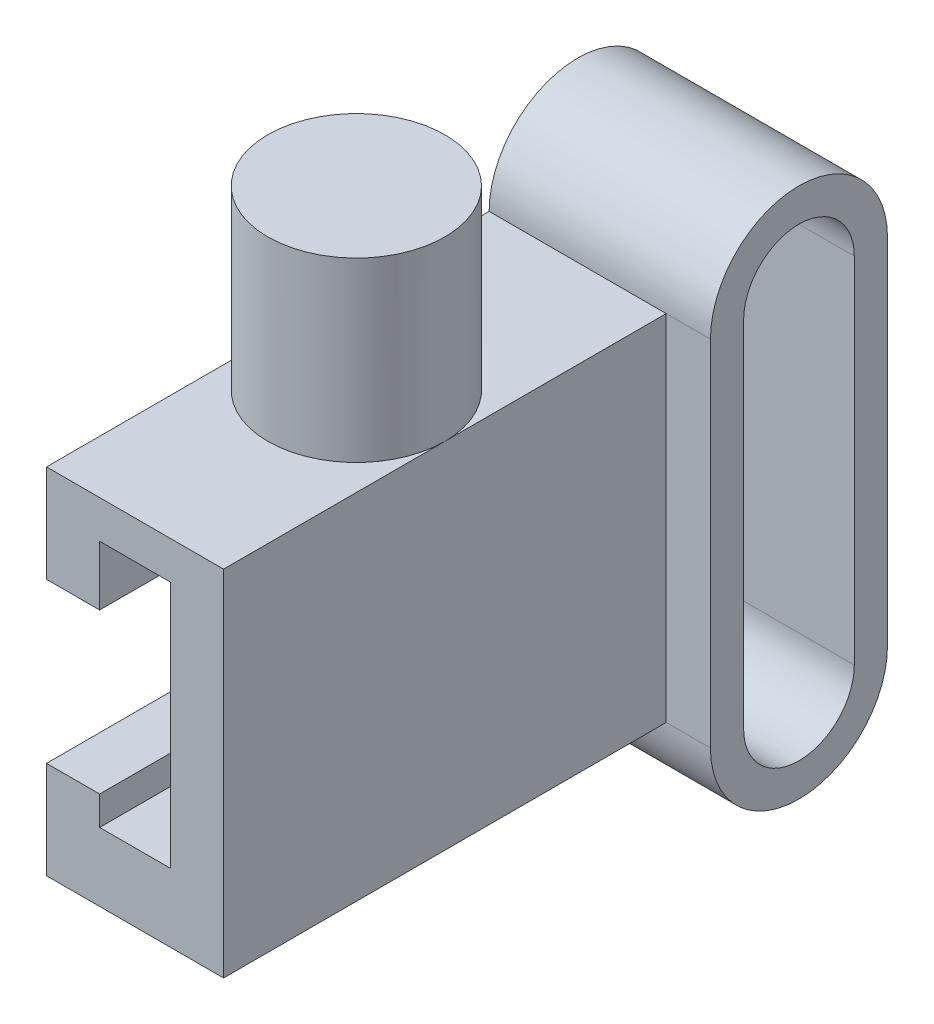
ISO-10303-21;
HEADER;
FILE_DESCRIPTION(('STEP AP214'),'2;1');
FILE_NAME('part.step','',(''),(''),'','','');
FILE_SCHEMA(('AUTOMOTIVE_DESIGN { 1 0 10303 214 1 1 1 1 }'));
ENDSEC;
DATA;
#1=APPLICATION_CONTEXT('core data for automotive mechanical design processes');
#2=APPLICATION_PROTOCOL_DEFINITION('international standard','automotive_design',2000,#1);
#3=PRODUCT_CONTEXT('',#1,'mechanical');
#4=PRODUCT('Part','Part','',(#3));
#5=PRODUCT_RELATED_PRODUCT_CATEGORY('part','',(#4));
#6=PRODUCT_DEFINITION_FORMATION('','',#4);
#7=PRODUCT_DEFINITION_CONTEXT('part definition',#1,'design');
#8=PRODUCT_DEFINITION('design','',#6,#7);
#9=PRODUCT_DEFINITION_SHAPE('','',#8);
#10=(LENGTH_UNIT() NAMED_UNIT(*) SI_UNIT(.MILLI.,.METRE.));
#11=(NAMED_UNIT(*) PLANE_ANGLE_UNIT() SI_UNIT($,.RADIAN.));
#12=(NAMED_UNIT(*) SI_UNIT($,.STERADIAN.) SOLID_ANGLE_UNIT());
#13=UNCERTAINTY_MEASURE_WITH_UNIT(LENGTH_MEASURE(1.E-05),#10,'distance_accuracy_value','');
#14=(GEOMETRIC_REPRESENTATION_CONTEXT(3) GLOBAL_UNCERTAINTY_ASSIGNED_CONTEXT((#13)) GLOBAL_UNIT_ASSIGNED_CONTEXT((#10,
#11,#12)) REPRESENTATION_CONTEXT('',''));
#15=CARTESIAN_POINT('',(0.,0.,0.));
#16=DIRECTION('',(0.,0.,1.));
#17=DIRECTION('',(1.,0.,0.));
#18=AXIS2_PLACEMENT_3D('',#15,#16,#17);
#19=CARTESIAN_POINT('',(-50.,40.,120.));
#20=DIRECTION('',(0.,-1.,0.));
#21=DIRECTION('',(0.,0.,-1.));
#22=AXIS2_PLACEMENT_3D('',#19,#20,#21);
#23=PLANE('',#22);
#24=CARTESIAN_POINT('',(-30.,40.,70.));
#25=DIRECTION('',(0.,-1.,0.));
#26=DIRECTION('',(0.,0.,-1.));
#27=AXIS2_PLACEMENT_3D('',#24,#25,#26);
#28=CIRCLE('',#27,20.);
#29=CARTESIAN_POINT('',(-50.,40.,70.));
#30=VERTEX_POINT('',#29);
#31=CARTESIAN_POINT('',(-10.,40.,70.));
#32=VERTEX_POINT('',#31);
#33=EDGE_CURVE('E11',#30,#32,#28,.F.);
#34=ORIENTED_EDGE('',*,*,#33,.F.);
#35=DIRECTION('',(0.,0.,-1.));
#36=VECTOR('',#35,1.);
#37=CARTESIAN_POINT('',(-50.,40.,120.));
#38=LINE('',#37,#36);
#39=CARTESIAN_POINT('',(-50.,40.,120.));
#40=VERTEX_POINT('',#39);
#41=EDGE_CURVE('E170',#40,#30,#38,.T.);
#42=ORIENTED_EDGE('',*,*,#41,.F.);
#43=DIRECTION('',(-1.,0.,0.));
#44=VECTOR('',#43,1.);
#45=CARTESIAN_POINT('',(-50.,40.,120.));
#46=LINE('',#45,#44);
#47=CARTESIAN_POINT('',(-10.,40.,120.));
#48=VERTEX_POINT('',#47);
#49=EDGE_CURVE('E187',#48,#40,#46,.T.);
#50=ORIENTED_EDGE('',*,*,#49,.F.);
#51=DIRECTION('',(0.,0.,-1.));
#52=VECTOR('',#51,1.);
#53=CARTESIAN_POINT('',(-10.,40.,120.));
#54=LINE('',#53,#52);
#55=EDGE_CURVE('E190',#48,#32,#54,.T.);
#56=ORIENTED_EDGE('',*,*,#55,.T.);
#57=EDGE_LOOP('',(#34,#42,#50,#56));
#58=FACE_BOUND('',#57,.T.);
#59=ADVANCED_FACE('F32',(#58),#23,.F.);
#60=CARTESIAN_POINT('',(-50.,40.,20.));
#61=DIRECTION('',(0.,0.,1.));
#62=DIRECTION('',(1.,0.,0.));
#63=AXIS2_PLACEMENT_3D('',#60,#61,#62);
#64=PLANE('',#63);
#65=DIRECTION('',(0.,1.,0.));
#66=VECTOR('',#65,1.);
#67=CARTESIAN_POINT('',(-38.,31.4576985678664,20.));
#68=LINE('',#67,#66);
#69=CARTESIAN_POINT('',(-38.,18.,20.));
#70=VERTEX_POINT('',#69);
#71=CARTESIAN_POINT('',(-38.,31.4576985678664,20.));
#72=VERTEX_POINT('',#71);
#73=EDGE_CURVE('E55',#70,#72,#68,.T.);
#74=ORIENTED_EDGE('',*,*,#73,.F.);
#75=DIRECTION('',(1.,0.,0.));
#76=VECTOR('',#75,1.);
#77=CARTESIAN_POINT('',(-38.,18.,20.));
#78=LINE('',#77,#76);
#79=CARTESIAN_POINT('',(-50.,18.,20.));
#80=VERTEX_POINT('',#79);
#81=EDGE_CURVE('E196',#80,#70,#78,.T.);
#82=ORIENTED_EDGE('',*,*,#81,.F.);
#83=DIRECTION('',(0.,-1.,0.));
#84=VECTOR('',#83,1.);
#85=CARTESIAN_POINT('',(-50.,40.,20.));
#86=LINE('',#85,#84);
#87=CARTESIAN_POINT('',(-50.,-18.,20.));
#88=VERTEX_POINT('',#87);
#89=EDGE_CURVE('E307',#80,#88,#86,.T.);
#90=ORIENTED_EDGE('',*,*,#89,.T.);
#91=DIRECTION('',(-1.,0.,0.));
#92=VECTOR('',#91,1.);
#93=CARTESIAN_POINT('',(-50.,-18.,20.));
#94=LINE('',#93,#92);
#95=CARTESIAN_POINT('',(-38.,-18.,20.));
#96=VERTEX_POINT('',#95);
#97=EDGE_CURVE('E236',#96,#88,#94,.T.);
#98=ORIENTED_EDGE('',*,*,#97,.F.);
#99=DIRECTION('',(0.,1.,0.));
#100=VECTOR('',#99,1.);
#101=CARTESIAN_POINT('',(-38.,-18.,20.));
#102=LINE('',#101,#100);
#103=CARTESIAN_POINT('',(-38.,-24.5423014321336,20.));
#104=VERTEX_POINT('',#103);
#105=EDGE_CURVE('E233',#104,#96,#102,.T.);
#106=ORIENTED_EDGE('',*,*,#105,.F.);
#107=DIRECTION('',(-1.,0.,0.));
#108=VECTOR('',#107,1.);
#109=CARTESIAN_POINT('',(-38.,-24.5423014321336,20.));
#110=LINE('',#109,#108);
#111=CARTESIAN_POINT('',(-22.,-24.5423014321336,20.));
#112=VERTEX_POINT('',#111);
#113=EDGE_CURVE('E230',#112,#104,#110,.T.);
#114=ORIENTED_EDGE('',*,*,#113,.F.);
#115=DIRECTION('',(0.,-1.,0.));
#116=VECTOR('',#115,1.);
#117=CARTESIAN_POINT('',(-22.,-24.5423014321336,20.));
#118=LINE('',#117,#116);
#119=CARTESIAN_POINT('',(-22.,31.4576985678664,20.));
#120=VERTEX_POINT('',#119);
#121=EDGE_CURVE('E227',#120,#112,#118,.T.);
#122=ORIENTED_EDGE('',*,*,#121,.F.);
#123=DIRECTION('',(1.,0.,0.));
#124=VECTOR('',#123,1.);
#125=CARTESIAN_POINT('',(-22.,31.4576985678664,20.));
#126=LINE('',#125,#124);
#127=EDGE_CURVE('E224',#72,#120,#126,.T.);
#128=ORIENTED_EDGE('',*,*,#127,.F.);
#129=EDGE_LOOP('',(#74,#82,#90,#98,#106,#114,#122,#128));
#130=FACE_BOUND('',#129,.T.);
#131=ADVANCED_FACE('F365',(#130),#64,.T.);
#132=DIRECTION('',(1.,0.,0.));
#133=VECTOR('',#132,1.);
#134=CARTESIAN_POINT('',(-50.,40.,20.));
#135=LINE('',#134,#133);
#136=CARTESIAN_POINT('',(-10.,40.,20.));
#137=VERTEX_POINT('',#136);
#138=CARTESIAN_POINT('',(0.,40.,20.));
#139=VERTEX_POINT('',#138);
#140=EDGE_CURVE('E316',#137,#139,#135,.T.);
#141=ORIENTED_EDGE('',*,*,#140,.F.);
#142=DIRECTION('',(0.,1.,0.));
#143=VECTOR('',#142,1.);
#144=CARTESIAN_POINT('',(-10.,40.,20.));
#145=LINE('',#144,#143);
#146=CARTESIAN_POINT('',(-9.99999999999999,-40.,20.));
#147=VERTEX_POINT('',#146);
#148=EDGE_CURVE('E201',#147,#137,#145,.T.);
#149=ORIENTED_EDGE('',*,*,#148,.F.);
#150=DIRECTION('',(1.,0.,0.));
#151=VECTOR('',#150,1.);
#152=CARTESIAN_POINT('',(-50.,-40.,20.));
#153=LINE('',#152,#151);
#154=CARTESIAN_POINT('',(0.,-40.,20.));
#155=VERTEX_POINT('',#154);
#156=EDGE_CURVE('E332',#147,#155,#153,.T.);
#157=ORIENTED_EDGE('',*,*,#156,.T.);
#158=DIRECTION('',(0.,-1.,0.));
#159=VECTOR('',#158,1.);
#160=CARTESIAN_POINT('',(0.,40.,20.));
#161=LINE('',#160,#159);
#162=EDGE_CURVE('E319',#139,#155,#161,.T.);
#163=ORIENTED_EDGE('',*,*,#162,.F.);
#164=EDGE_LOOP('',(#141,#149,#157,#163));
#165=FACE_BOUND('',#164,.T.);
#166=ADVANCED_FACE('F338',(#165),#64,.T.);
#167=CARTESIAN_POINT('',(-50.,40.,0.));
#168=DIRECTION('',(1.,0.,0.));
#169=DIRECTION('',(0.,0.,-1.));
#170=AXIS2_PLACEMENT_3D('',#167,#168,#169);
#171=CYLINDRICAL_SURFACE('',#170,20.);
#172=CARTESIAN_POINT('',(0.,40.,0.));
#173=DIRECTION('',(1.,0.,0.));
#174=DIRECTION('',(0.,0.,1.));
#175=AXIS2_PLACEMENT_3D('',#172,#173,#174);
#176=CIRCLE('',#175,20.);
#177=CARTESIAN_POINT('',(0.,40.,-20.));
#178=VERTEX_POINT('',#177);
#179=EDGE_CURVE('E298',#178,#139,#176,.T.);
#180=ORIENTED_EDGE('',*,*,#179,.F.);
#181=DIRECTION('',(1.,0.,0.));
#182=VECTOR('',#181,1.);
#183=CARTESIAN_POINT('',(-50.,40.,-20.));
#184=LINE('',#183,#182);
#185=CARTESIAN_POINT('',(-50.,40.,-20.));
#186=VERTEX_POINT('',#185);
#187=EDGE_CURVE('E40',#186,#178,#184,.T.);
#188=ORIENTED_EDGE('',*,*,#187,.F.);
#189=CARTESIAN_POINT('',(-50.,40.,0.));
#190=DIRECTION('',(1.,0.,0.));
#191=DIRECTION('',(0.,0.,1.));
#192=AXIS2_PLACEMENT_3D('',#189,#190,#191);
#193=CIRCLE('',#192,20.);
#194=CARTESIAN_POINT('',(-50.,40.,20.));
#195=VERTEX_POINT('',#194);
#196=EDGE_CURVE('E305',#186,#195,#193,.T.);
#197=ORIENTED_EDGE('',*,*,#196,.T.);
#198=EDGE_CURVE('E186',#195,#137,#135,.T.);
#199=ORIENTED_EDGE('',*,*,#198,.T.);
#200=ORIENTED_EDGE('',*,*,#140,.T.);
#201=EDGE_LOOP('',(#180,#188,#197,#199,#200));
#202=FACE_BOUND('',#201,.T.);
#203=ADVANCED_FACE('F34',(#202),#171,.T.);
#204=CARTESIAN_POINT('',(-50.,40.,-20.));
#205=DIRECTION('',(0.,0.,-1.));
#206=DIRECTION('',(0.,1.,0.));
#207=AXIS2_PLACEMENT_3D('',#204,#205,#206);
#208=PLANE('',#207);
#209=DIRECTION('',(0.,1.,0.));
#210=VECTOR('',#209,1.);
#211=CARTESIAN_POINT('',(0.,40.,-20.));
#212=LINE('',#211,#210);
#213=CARTESIAN_POINT('',(0.,-40.,-20.));
#214=VERTEX_POINT('',#213);
#215=EDGE_CURVE('E308',#214,#178,#212,.T.);
#216=ORIENTED_EDGE('',*,*,#215,.F.);
#217=DIRECTION('',(1.,0.,0.));
#218=VECTOR('',#217,1.);
#219=CARTESIAN_POINT('',(-50.,-40.,-20.));
#220=LINE('',#219,#218);
#221=CARTESIAN_POINT('',(-50.,-40.,-20.));
#222=VERTEX_POINT('',#221);
#223=EDGE_CURVE('E328',#222,#214,#220,.T.);
#224=ORIENTED_EDGE('',*,*,#223,.F.);
#225=DIRECTION('',(0.,1.,0.));
#226=VECTOR('',#225,1.);
#227=CARTESIAN_POINT('',(-50.,40.,-20.));
#228=LINE('',#227,#226);
#229=EDGE_CURVE('E313',#222,#186,#228,.T.);
#230=ORIENTED_EDGE('',*,*,#229,.T.);
#231=ORIENTED_EDGE('',*,*,#187,.T.);
#232=EDGE_LOOP('',(#216,#224,#230,#231));
#233=FACE_BOUND('',#232,.T.);
#234=ADVANCED_FACE('F345',(#233),#208,.T.);
#235=CARTESIAN_POINT('',(-50.,-40.,0.));
#236=DIRECTION('',(1.,0.,0.));
#237=DIRECTION('',(0.,0.,-1.));
#238=AXIS2_PLACEMENT_3D('',#235,#236,#237);
#239=CYLINDRICAL_SURFACE('',#238,20.);
#240=CARTESIAN_POINT('',(0.,-40.,0.));
#241=DIRECTION('',(1.,0.,0.));
#242=DIRECTION('',(0.,0.,-1.));
#243=AXIS2_PLACEMENT_3D('',#240,#241,#242);
#244=CIRCLE('',#243,20.);
#245=EDGE_CURVE('E322',#155,#214,#244,.T.);
#246=ORIENTED_EDGE('',*,*,#245,.F.);
#247=ORIENTED_EDGE('',*,*,#156,.F.);
#248=CARTESIAN_POINT('',(-50.,-40.,20.));
#249=VERTEX_POINT('',#248);
#250=EDGE_CURVE('E330',#249,#147,#153,.T.);
#251=ORIENTED_EDGE('',*,*,#250,.F.);
#252=CARTESIAN_POINT('',(-50.,-40.,0.));
#253=DIRECTION('',(1.,0.,0.));
#254=DIRECTION('',(0.,0.,-1.));
#255=AXIS2_PLACEMENT_3D('',#252,#253,#254);
#256=CIRCLE('',#255,20.);
#257=EDGE_CURVE('E310',#249,#222,#256,.T.);
#258=ORIENTED_EDGE('',*,*,#257,.T.);
#259=ORIENTED_EDGE('',*,*,#223,.T.);
#260=EDGE_LOOP('',(#246,#247,#251,#258,#259));
#261=FACE_BOUND('',#260,.T.);
#262=ADVANCED_FACE('F352',(#261),#239,.T.);
#263=CARTESIAN_POINT('',(-50.,40.,0.));
#264=DIRECTION('',(-1.,0.,0.));
#265=DIRECTION('',(0.,0.,1.));
#266=AXIS2_PLACEMENT_3D('',#263,#264,#265);
#267=PLANE('',#266);
#268=CARTESIAN_POINT('',(-50.,-40.,0.));
#269=DIRECTION('',(1.,0.,0.));
#270=DIRECTION('',(0.,0.,-1.));
#271=AXIS2_PLACEMENT_3D('',#268,#269,#270);
#272=CIRCLE('',#271,12.5);
#273=CARTESIAN_POINT('',(-50.,-40.,12.5));
#274=VERTEX_POINT('',#273);
#275=CARTESIAN_POINT('',(-50.,-40.,-12.5));
#276=VERTEX_POINT('',#275);
#277=EDGE_CURVE('E273',#274,#276,#272,.T.);
#278=ORIENTED_EDGE('',*,*,#277,.T.);
#279=DIRECTION('',(0.,1.,0.));
#280=VECTOR('',#279,1.);
#281=CARTESIAN_POINT('',(-50.,40.,-12.5));
#282=LINE('',#281,#280);
#283=CARTESIAN_POINT('',(-50.,40.,-12.5));
#284=VERTEX_POINT('',#283);
#285=EDGE_CURVE('E276',#276,#284,#282,.T.);
#286=ORIENTED_EDGE('',*,*,#285,.T.);
#287=CARTESIAN_POINT('',(-50.,40.,0.));
#288=DIRECTION('',(1.,0.,0.));
#289=DIRECTION('',(0.,0.,1.));
#290=AXIS2_PLACEMENT_3D('',#287,#288,#289);
#291=CIRCLE('',#290,12.5);
#292=CARTESIAN_POINT('',(-50.,40.,12.5));
#293=VERTEX_POINT('',#292);
#294=EDGE_CURVE('E280',#284,#293,#291,.T.);
#295=ORIENTED_EDGE('',*,*,#294,.T.);
#296=DIRECTION('',(0.,-1.,0.));
#297=VECTOR('',#296,1.);
#298=CARTESIAN_POINT('',(-50.,40.,12.5));
#299=LINE('',#298,#297);
#300=EDGE_CURVE('E283',#293,#274,#299,.T.);
#301=ORIENTED_EDGE('',*,*,#300,.T.);
#302=EDGE_LOOP('',(#278,#286,#295,#301));
#303=FACE_BOUND('',#302,.T.);
#304=ORIENTED_EDGE('',*,*,#196,.F.);
#305=ORIENTED_EDGE('',*,*,#229,.F.);
#306=ORIENTED_EDGE('',*,*,#257,.F.);
#307=DIRECTION('',(0.,0.,-1.));
#308=VECTOR('',#307,1.);
#309=CARTESIAN_POINT('',(-50.,-40.,120.));
#310=LINE('',#309,#308);
#311=CARTESIAN_POINT('',(-50.,-40.,120.));
#312=VERTEX_POINT('',#311);
#313=EDGE_CURVE('E245',#312,#249,#310,.T.);
#314=ORIENTED_EDGE('',*,*,#313,.F.);
#315=DIRECTION('',(0.,-1.,0.));
#316=VECTOR('',#315,1.);
#317=CARTESIAN_POINT('',(-50.,-40.,120.));
#318=LINE('',#317,#316);
#319=CARTESIAN_POINT('',(-50.,-18.,120.));
#320=VERTEX_POINT('',#319);
#321=EDGE_CURVE('E215',#320,#312,#318,.T.);
#322=ORIENTED_EDGE('',*,*,#321,.F.);
#323=DIRECTION('',(0.,0.,-1.));
#324=VECTOR('',#323,1.);
#325=CARTESIAN_POINT('',(-50.,-18.,120.));
#326=LINE('',#325,#324);
#327=EDGE_CURVE('E248',#320,#88,#326,.T.);
#328=ORIENTED_EDGE('',*,*,#327,.T.);
#329=ORIENTED_EDGE('',*,*,#89,.F.);
#330=DIRECTION('',(0.,0.,-1.));
#331=VECTOR('',#330,1.);
#332=CARTESIAN_POINT('',(-50.,18.,120.));
#333=LINE('',#332,#331);
#334=CARTESIAN_POINT('',(-50.,18.,120.));
#335=VERTEX_POINT('',#334);
#336=EDGE_CURVE('E269',#335,#80,#333,.T.);
#337=ORIENTED_EDGE('',*,*,#336,.F.);
#338=DIRECTION('',(0.,-1.,0.));
#339=VECTOR('',#338,1.);
#340=CARTESIAN_POINT('',(-50.,18.,120.));
#341=LINE('',#340,#339);
#342=EDGE_CURVE('E177',#40,#335,#341,.T.);
#343=ORIENTED_EDGE('',*,*,#342,.F.);
#344=ORIENTED_EDGE('',*,*,#41,.T.);
#345=EDGE_CURVE('E173',#30,#195,#38,.T.);
#346=ORIENTED_EDGE('',*,*,#345,.T.);
#347=EDGE_LOOP('',(#304,#305,#306,#314,#322,#328,#329,#337,#343,#344,#346));
#348=FACE_BOUND('',#347,.T.);
#349=ADVANCED_FACE('F172',(#303,#348),#267,.T.);
#350=CARTESIAN_POINT('',(0.,40.,0.));
#351=DIRECTION('',(-1.,0.,0.));
#352=DIRECTION('',(0.,0.,1.));
#353=AXIS2_PLACEMENT_3D('',#350,#351,#352);
#354=PLANE('',#353);
#355=DIRECTION('',(0.,1.,0.));
#356=VECTOR('',#355,1.);
#357=CARTESIAN_POINT('',(0.,40.,-12.5));
#358=LINE('',#357,#356);
#359=CARTESIAN_POINT('',(0.,-40.,-12.5));
#360=VERTEX_POINT('',#359);
#361=CARTESIAN_POINT('',(0.,40.,-12.5));
#362=VERTEX_POINT('',#361);
#363=EDGE_CURVE('E288',#360,#362,#358,.T.);
#364=ORIENTED_EDGE('',*,*,#363,.F.);
#365=CARTESIAN_POINT('',(0.,-40.,0.));
#366=DIRECTION('',(1.,0.,0.));
#367=DIRECTION('',(0.,0.,-1.));
#368=AXIS2_PLACEMENT_3D('',#365,#366,#367);
#369=CIRCLE('',#368,12.5);
#370=CARTESIAN_POINT('',(0.,-40.,12.5));
#371=VERTEX_POINT('',#370);
#372=EDGE_CURVE('E272',#371,#360,#369,.T.);
#373=ORIENTED_EDGE('',*,*,#372,.F.);
#374=DIRECTION('',(0.,-1.,0.));
#375=VECTOR('',#374,1.);
#376=CARTESIAN_POINT('',(0.,40.,12.5));
#377=LINE('',#376,#375);
#378=CARTESIAN_POINT('',(0.,40.,12.5));
#379=VERTEX_POINT('',#378);
#380=EDGE_CURVE('E277',#379,#371,#377,.T.);
#381=ORIENTED_EDGE('',*,*,#380,.F.);
#382=CARTESIAN_POINT('',(0.,40.,0.));
#383=DIRECTION('',(1.,0.,0.));
#384=DIRECTION('',(0.,0.,1.));
#385=AXIS2_PLACEMENT_3D('',#382,#383,#384);
#386=CIRCLE('',#385,12.5);
#387=EDGE_CURVE('E291',#362,#379,#386,.T.);
#388=ORIENTED_EDGE('',*,*,#387,.F.);
#389=EDGE_LOOP('',(#364,#373,#381,#388));
#390=FACE_BOUND('',#389,.T.);
#391=ORIENTED_EDGE('',*,*,#179,.T.);
#392=ORIENTED_EDGE('',*,*,#162,.T.);
#393=ORIENTED_EDGE('',*,*,#245,.T.);
#394=ORIENTED_EDGE('',*,*,#215,.T.);
#395=EDGE_LOOP('',(#391,#392,#393,#394));
#396=FACE_BOUND('',#395,.T.);
#397=ADVANCED_FACE('F342',(#390,#396),#354,.F.);
#398=CARTESIAN_POINT('',(-50.,-40.,0.));
#399=DIRECTION('',(1.,0.,0.));
#400=DIRECTION('',(0.,0.,-1.));
#401=AXIS2_PLACEMENT_3D('',#398,#399,#400);
#402=CYLINDRICAL_SURFACE('',#401,12.5);
#403=ORIENTED_EDGE('',*,*,#372,.T.);
#404=DIRECTION('',(1.,0.,0.));
#405=VECTOR('',#404,1.);
#406=CARTESIAN_POINT('',(-50.,-40.,-12.5));
#407=LINE('',#406,#405);
#408=EDGE_CURVE('E286',#276,#360,#407,.T.);
#409=ORIENTED_EDGE('',*,*,#408,.F.);
#410=ORIENTED_EDGE('',*,*,#277,.F.);
#411=DIRECTION('',(1.,0.,0.));
#412=VECTOR('',#411,1.);
#413=CARTESIAN_POINT('',(-50.,-40.,12.5));
#414=LINE('',#413,#412);
#415=EDGE_CURVE('E296',#274,#371,#414,.T.);
#416=ORIENTED_EDGE('',*,*,#415,.T.);
#417=EDGE_LOOP('',(#403,#409,#410,#416));
#418=FACE_BOUND('',#417,.T.);
#419=ADVANCED_FACE('F513',(#418),#402,.F.);
#420=CARTESIAN_POINT('',(-50.,40.,12.5));
#421=DIRECTION('',(0.,0.,1.));
#422=DIRECTION('',(0.,-1.,0.));
#423=AXIS2_PLACEMENT_3D('',#420,#421,#422);
#424=PLANE('',#423);
#425=ORIENTED_EDGE('',*,*,#380,.T.);
#426=ORIENTED_EDGE('',*,*,#415,.F.);
#427=ORIENTED_EDGE('',*,*,#300,.F.);
#428=DIRECTION('',(1.,0.,0.));
#429=VECTOR('',#428,1.);
#430=CARTESIAN_POINT('',(-50.,40.,12.5));
#431=LINE('',#430,#429);
#432=EDGE_CURVE('E299',#293,#379,#431,.T.);
#433=ORIENTED_EDGE('',*,*,#432,.T.);
#434=EDGE_LOOP('',(#425,#426,#427,#433));
#435=FACE_BOUND('',#434,.T.);
#436=ADVANCED_FACE('F522',(#435),#424,.F.);
#437=CARTESIAN_POINT('',(-50.,40.,0.));
#438=DIRECTION('',(1.,0.,0.));
#439=DIRECTION('',(0.,0.,-1.));
#440=AXIS2_PLACEMENT_3D('',#437,#438,#439);
#441=CYLINDRICAL_SURFACE('',#440,12.5);
#442=ORIENTED_EDGE('',*,*,#387,.T.);
#443=ORIENTED_EDGE('',*,*,#432,.F.);
#444=ORIENTED_EDGE('',*,*,#294,.F.);
#445=DIRECTION('',(1.,0.,0.));
#446=VECTOR('',#445,1.);
#447=CARTESIAN_POINT('',(-50.,40.,-12.5));
#448=LINE('',#447,#446);
#449=EDGE_CURVE('E301',#284,#362,#448,.T.);
#450=ORIENTED_EDGE('',*,*,#449,.T.);
#451=EDGE_LOOP('',(#442,#443,#444,#450));
#452=FACE_BOUND('',#451,.T.);
#453=ADVANCED_FACE('F396',(#452),#441,.F.);
#454=CARTESIAN_POINT('',(-50.,40.,-12.5));
#455=DIRECTION('',(0.,0.,-1.));
#456=DIRECTION('',(0.,1.,0.));
#457=AXIS2_PLACEMENT_3D('',#454,#455,#456);
#458=PLANE('',#457);
#459=ORIENTED_EDGE('',*,*,#363,.T.);
#460=ORIENTED_EDGE('',*,*,#449,.F.);
#461=ORIENTED_EDGE('',*,*,#285,.F.);
#462=ORIENTED_EDGE('',*,*,#408,.T.);
#463=EDGE_LOOP('',(#459,#460,#461,#462));
#464=FACE_BOUND('',#463,.T.);
#465=ADVANCED_FACE('F389',(#464),#458,.F.);
#466=CARTESIAN_POINT('',(-38.,18.,120.));
#467=DIRECTION('',(0.,1.,0.));
#468=DIRECTION('',(-1.,0.,0.));
#469=AXIS2_PLACEMENT_3D('',#466,#467,#468);
#470=PLANE('',#469);
#471=ORIENTED_EDGE('',*,*,#81,.T.);
#472=DIRECTION('',(0.,0.,-1.));
#473=VECTOR('',#472,1.);
#474=CARTESIAN_POINT('',(-38.,18.,120.));
#475=LINE('',#474,#473);
#476=CARTESIAN_POINT('',(-38.,18.,120.));
#477=VERTEX_POINT('',#476);
#478=EDGE_CURVE('E266',#477,#70,#475,.T.);
#479=ORIENTED_EDGE('',*,*,#478,.F.);
#480=DIRECTION('',(1.,0.,0.));
#481=VECTOR('',#480,1.);
#482=CARTESIAN_POINT('',(-38.,18.,120.));
#483=LINE('',#482,#481);
#484=EDGE_CURVE('E200',#335,#477,#483,.T.);
#485=ORIENTED_EDGE('',*,*,#484,.F.);
#486=ORIENTED_EDGE('',*,*,#336,.T.);
#487=EDGE_LOOP('',(#471,#479,#485,#486));
#488=FACE_BOUND('',#487,.T.);
#489=ADVANCED_FACE('F387',(#488),#470,.F.);
#490=CARTESIAN_POINT('',(-38.,31.4576985678664,120.));
#491=DIRECTION('',(-1.,0.,0.));
#492=DIRECTION('',(0.,0.,1.));
#493=AXIS2_PLACEMENT_3D('',#490,#491,#492);
#494=PLANE('',#493);
#495=ORIENTED_EDGE('',*,*,#73,.T.);
#496=DIRECTION('',(0.,0.,-1.));
#497=VECTOR('',#496,1.);
#498=CARTESIAN_POINT('',(-38.,31.4576985678664,120.));
#499=LINE('',#498,#497);
#500=CARTESIAN_POINT('',(-38.,31.4576985678664,120.));
#501=VERTEX_POINT('',#500);
#502=EDGE_CURVE('E263',#501,#72,#499,.T.);
#503=ORIENTED_EDGE('',*,*,#502,.F.);
#504=DIRECTION('',(0.,1.,0.));
#505=VECTOR('',#504,1.);
#506=CARTESIAN_POINT('',(-38.,31.4576985678664,120.));
#507=LINE('',#506,#505);
#508=EDGE_CURVE('E203',#477,#501,#507,.T.);
#509=ORIENTED_EDGE('',*,*,#508,.F.);
#510=ORIENTED_EDGE('',*,*,#478,.T.);
#511=EDGE_LOOP('',(#495,#503,#509,#510));
#512=FACE_BOUND('',#511,.T.);
#513=ADVANCED_FACE('F383',(#512),#494,.F.);
#514=CARTESIAN_POINT('',(-22.,31.4576985678664,120.));
#515=DIRECTION('',(0.,1.,0.));
#516=DIRECTION('',(0.,0.,1.));
#517=AXIS2_PLACEMENT_3D('',#514,#515,#516);
#518=PLANE('',#517);
#519=ORIENTED_EDGE('',*,*,#127,.T.);
#520=DIRECTION('',(0.,0.,-1.));
#521=VECTOR('',#520,1.);
#522=CARTESIAN_POINT('',(-22.,31.4576985678664,120.));
#523=LINE('',#522,#521);
#524=CARTESIAN_POINT('',(-22.,31.4576985678664,120.));
#525=VERTEX_POINT('',#524);
#526=EDGE_CURVE('E260',#525,#120,#523,.T.);
#527=ORIENTED_EDGE('',*,*,#526,.F.);
#528=DIRECTION('',(1.,0.,0.));
#529=VECTOR('',#528,1.);
#530=CARTESIAN_POINT('',(-22.,31.4576985678664,120.));
#531=LINE('',#530,#529);
#532=EDGE_CURVE('E205',#501,#525,#531,.T.);
#533=ORIENTED_EDGE('',*,*,#532,.F.);
#534=ORIENTED_EDGE('',*,*,#502,.T.);
#535=EDGE_LOOP('',(#519,#527,#533,#534));
#536=FACE_BOUND('',#535,.T.);
#537=ADVANCED_FACE('F380',(#536),#518,.F.);
#538=CARTESIAN_POINT('',(-22.,-24.5423014321336,120.));
#539=DIRECTION('',(1.,0.,0.));
#540=DIRECTION('',(0.,0.,-1.));
#541=AXIS2_PLACEMENT_3D('',#538,#539,#540);
#542=PLANE('',#541);
#543=ORIENTED_EDGE('',*,*,#121,.T.);
#544=DIRECTION('',(0.,0.,-1.));
#545=VECTOR('',#544,1.);
#546=CARTESIAN_POINT('',(-22.,-24.5423014321336,120.));
#547=LINE('',#546,#545);
#548=CARTESIAN_POINT('',(-22.,-24.5423014321336,120.));
#549=VERTEX_POINT('',#548);
#550=EDGE_CURVE('E257',#549,#112,#547,.T.);
#551=ORIENTED_EDGE('',*,*,#550,.F.);
#552=DIRECTION('',(0.,-1.,0.));
#553=VECTOR('',#552,1.);
#554=CARTESIAN_POINT('',(-22.,-24.5423014321336,120.));
#555=LINE('',#554,#553);
#556=EDGE_CURVE('E207',#525,#549,#555,.T.);
#557=ORIENTED_EDGE('',*,*,#556,.F.);
#558=ORIENTED_EDGE('',*,*,#526,.T.);
#559=EDGE_LOOP('',(#543,#551,#557,#558));
#560=FACE_BOUND('',#559,.T.);
#561=ADVANCED_FACE('F375',(#560),#542,.F.);
#562=CARTESIAN_POINT('',(-38.,-24.5423014321336,120.));
#563=DIRECTION('',(0.,-1.,0.));
#564=DIRECTION('',(0.,0.,-1.));
#565=AXIS2_PLACEMENT_3D('',#562,#563,#564);
#566=PLANE('',#565);
#567=ORIENTED_EDGE('',*,*,#113,.T.);
#568=DIRECTION('',(0.,0.,-1.));
#569=VECTOR('',#568,1.);
#570=CARTESIAN_POINT('',(-38.,-24.5423014321336,120.));
#571=LINE('',#570,#569);
#572=CARTESIAN_POINT('',(-38.,-24.5423014321336,120.));
#573=VERTEX_POINT('',#572);
#574=EDGE_CURVE('E254',#573,#104,#571,.T.);
#575=ORIENTED_EDGE('',*,*,#574,.F.);
#576=DIRECTION('',(-1.,0.,0.));
#577=VECTOR('',#576,1.);
#578=CARTESIAN_POINT('',(-38.,-24.5423014321336,120.));
#579=LINE('',#578,#577);
#580=EDGE_CURVE('E209',#549,#573,#579,.T.);
#581=ORIENTED_EDGE('',*,*,#580,.F.);
#582=ORIENTED_EDGE('',*,*,#550,.T.);
#583=EDGE_LOOP('',(#567,#575,#581,#582));
#584=FACE_BOUND('',#583,.T.);
#585=ADVANCED_FACE('F372',(#584),#566,.F.);
#586=CARTESIAN_POINT('',(-38.,-18.,120.));
#587=DIRECTION('',(-1.,0.,0.));
#588=DIRECTION('',(0.,-1.,0.));
#589=AXIS2_PLACEMENT_3D('',#586,#587,#588);
#590=PLANE('',#589);
#591=ORIENTED_EDGE('',*,*,#105,.T.);
#592=DIRECTION('',(0.,0.,-1.));
#593=VECTOR('',#592,1.);
#594=CARTESIAN_POINT('',(-38.,-18.,120.));
#595=LINE('',#594,#593);
#596=CARTESIAN_POINT('',(-38.,-18.,120.));
#597=VERTEX_POINT('',#596);
#598=EDGE_CURVE('E251',#597,#96,#595,.T.);
#599=ORIENTED_EDGE('',*,*,#598,.F.);
#600=DIRECTION('',(0.,1.,0.));
#601=VECTOR('',#600,1.);
#602=CARTESIAN_POINT('',(-38.,-18.,120.));
#603=LINE('',#602,#601);
#604=EDGE_CURVE('E211',#573,#597,#603,.T.);
#605=ORIENTED_EDGE('',*,*,#604,.F.);
#606=ORIENTED_EDGE('',*,*,#574,.T.);
#607=EDGE_LOOP('',(#591,#599,#605,#606));
#608=FACE_BOUND('',#607,.T.);
#609=ADVANCED_FACE('F367',(#608),#590,.F.);
#610=CARTESIAN_POINT('',(-50.,-18.,120.));
#611=DIRECTION('',(0.,-1.,0.));
#612=DIRECTION('',(0.,0.,-1.));
#613=AXIS2_PLACEMENT_3D('',#610,#611,#612);
#614=PLANE('',#613);
#615=ORIENTED_EDGE('',*,*,#97,.T.);
#616=ORIENTED_EDGE('',*,*,#327,.F.);
#617=DIRECTION('',(-1.,0.,0.));
#618=VECTOR('',#617,1.);
#619=CARTESIAN_POINT('',(-50.,-18.,120.));
#620=LINE('',#619,#618);
#621=EDGE_CURVE('E213',#597,#320,#620,.T.);
#622=ORIENTED_EDGE('',*,*,#621,.F.);
#623=ORIENTED_EDGE('',*,*,#598,.T.);
#624=EDGE_LOOP('',(#615,#616,#622,#623));
#625=FACE_BOUND('',#624,.T.);
#626=ADVANCED_FACE('F363',(#625),#614,.F.);
#627=CARTESIAN_POINT('',(-9.99999999999999,-40.,120.));
#628=DIRECTION('',(0.,1.,0.));
#629=DIRECTION('',(0.,0.,1.));
#630=AXIS2_PLACEMENT_3D('',#627,#628,#629);
#631=PLANE('',#630);
#632=ORIENTED_EDGE('',*,*,#250,.T.);
#633=DIRECTION('',(0.,0.,-1.));
#634=VECTOR('',#633,1.);
#635=CARTESIAN_POINT('',(-9.99999999999999,-40.,120.));
#636=LINE('',#635,#634);
#637=CARTESIAN_POINT('',(-9.99999999999999,-40.,120.));
#638=VERTEX_POINT('',#637);
#639=EDGE_CURVE('E242',#638,#147,#636,.T.);
#640=ORIENTED_EDGE('',*,*,#639,.F.);
#641=DIRECTION('',(1.,0.,0.));
#642=VECTOR('',#641,1.);
#643=CARTESIAN_POINT('',(-9.99999999999999,-40.,120.));
#644=LINE('',#643,#642);
#645=EDGE_CURVE('E217',#312,#638,#644,.T.);
#646=ORIENTED_EDGE('',*,*,#645,.F.);
#647=ORIENTED_EDGE('',*,*,#313,.T.);
#648=EDGE_LOOP('',(#632,#640,#646,#647));
#649=FACE_BOUND('',#648,.T.);
#650=ADVANCED_FACE('F355',(#649),#631,.F.);
#651=CARTESIAN_POINT('',(-10.,40.,120.));
#652=DIRECTION('',(-1.,0.,0.));
#653=DIRECTION('',(0.,-1.,0.));
#654=AXIS2_PLACEMENT_3D('',#651,#652,#653);
#655=PLANE('',#654);
#656=ORIENTED_EDGE('',*,*,#148,.T.);
#657=EDGE_CURVE('E181',#32,#137,#54,.T.);
#658=ORIENTED_EDGE('',*,*,#657,.F.);
#659=ORIENTED_EDGE('',*,*,#55,.F.);
#660=DIRECTION('',(0.,1.,0.));
#661=VECTOR('',#660,1.);
#662=CARTESIAN_POINT('',(-10.,40.,120.));
#663=LINE('',#662,#661);
#664=EDGE_CURVE('E219',#638,#48,#663,.T.);
#665=ORIENTED_EDGE('',*,*,#664,.F.);
#666=ORIENTED_EDGE('',*,*,#639,.T.);
#667=EDGE_LOOP('',(#656,#658,#659,#665,#666));
#668=FACE_BOUND('',#667,.T.);
#669=ADVANCED_FACE('F408',(#668),#655,.F.);
#670=CARTESIAN_POINT('',(-30.,40.,70.));
#671=DIRECTION('',(0.,1.,0.));
#672=DIRECTION('',(0.,0.,1.));
#673=AXIS2_PLACEMENT_3D('',#670,#671,#672);
#674=CIRCLE('',#673,20.);
#675=EDGE_CURVE('E47',#32,#30,#674,.T.);
#676=ORIENTED_EDGE('',*,*,#675,.F.);
#677=ORIENTED_EDGE('',*,*,#657,.T.);
#678=ORIENTED_EDGE('',*,*,#198,.F.);
#679=ORIENTED_EDGE('',*,*,#345,.F.);
#680=EDGE_LOOP('',(#676,#677,#678,#679));
#681=FACE_BOUND('',#680,.T.);
#682=ADVANCED_FACE('F184',(#681),#23,.F.);
#683=CARTESIAN_POINT('',(0.,0.,120.));
#684=DIRECTION('',(0.,0.,-1.));
#685=DIRECTION('',(-1.,0.,0.));
#686=AXIS2_PLACEMENT_3D('',#683,#684,#685);
#687=PLANE('',#686);
#688=ORIENTED_EDGE('',*,*,#342,.T.);
#689=ORIENTED_EDGE('',*,*,#484,.T.);
#690=ORIENTED_EDGE('',*,*,#508,.T.);
#691=ORIENTED_EDGE('',*,*,#532,.T.);
#692=ORIENTED_EDGE('',*,*,#556,.T.);
#693=ORIENTED_EDGE('',*,*,#580,.T.);
#694=ORIENTED_EDGE('',*,*,#604,.T.);
#695=ORIENTED_EDGE('',*,*,#621,.T.);
#696=ORIENTED_EDGE('',*,*,#321,.T.);
#697=ORIENTED_EDGE('',*,*,#645,.T.);
#698=ORIENTED_EDGE('',*,*,#664,.T.);
#699=ORIENTED_EDGE('',*,*,#49,.T.);
#700=EDGE_LOOP('',(#688,#689,#690,#691,#692,#693,#694,#695,#696,#697,#698,#699));
#701=FACE_BOUND('',#700,.T.);
#702=ADVANCED_FACE('F358',(#701),#687,.F.);
#703=CARTESIAN_POINT('',(-30.,80.,70.));
#704=DIRECTION('',(0.,-1.,0.));
#705=DIRECTION('',(0.,0.,-1.));
#706=AXIS2_PLACEMENT_3D('',#703,#704,#705);
#707=CYLINDRICAL_SURFACE('',#706,20.);
#708=CARTESIAN_POINT('',(-30.,80.,70.));
#709=DIRECTION('',(0.,1.,0.));
#710=DIRECTION('',(0.,0.,1.));
#711=AXIS2_PLACEMENT_3D('',#708,#709,#710);
#712=CIRCLE('',#711,20.);
#713=CARTESIAN_POINT('',(-30.,80.,90.));
#714=VERTEX_POINT('',#713);
#715=EDGE_CURVE('E193',#714,#714,#712,.T.);
#716=ORIENTED_EDGE('',*,*,#715,.F.);
#717=EDGE_LOOP('',(#716));
#718=FACE_BOUND('',#717,.T.);
#719=ORIENTED_EDGE('',*,*,#675,.T.);
#720=ORIENTED_EDGE('',*,*,#33,.T.);
#721=EDGE_LOOP('',(#719,#720));
#722=FACE_BOUND('',#721,.T.);
#723=ADVANCED_FACE('F192',(#718,#722),#707,.T.);
#724=CARTESIAN_POINT('',(-30.,80.,70.));
#725=DIRECTION('',(0.,1.,0.));
#726=DIRECTION('',(0.,0.,1.));
#727=AXIS2_PLACEMENT_3D('',#724,#725,#726);
#728=PLANE('',#727);
#729=ORIENTED_EDGE('',*,*,#715,.T.);
#730=EDGE_LOOP('',(#729));
#731=FACE_BOUND('',#730,.T.);
#732=ADVANCED_FACE('F492',(#731),#728,.T.);
#733=CLOSED_SHELL('',(#59,#131,#166,#203,#234,#262,#349,#397,#419,#436,#453,#465,#489,#513,#537,
#561,#585,#609,#626,#650,#669,#682,#702,#723,#732));
#734=MANIFOLD_SOLID_BREP('B2',#733);
#735=ADVANCED_BREP_SHAPE_REPRESENTATION('',(#18,#734),#14);
#736=SHAPE_DEFINITION_REPRESENTATION(#9,#735);
ENDSEC;
END-ISO-10303-21;
